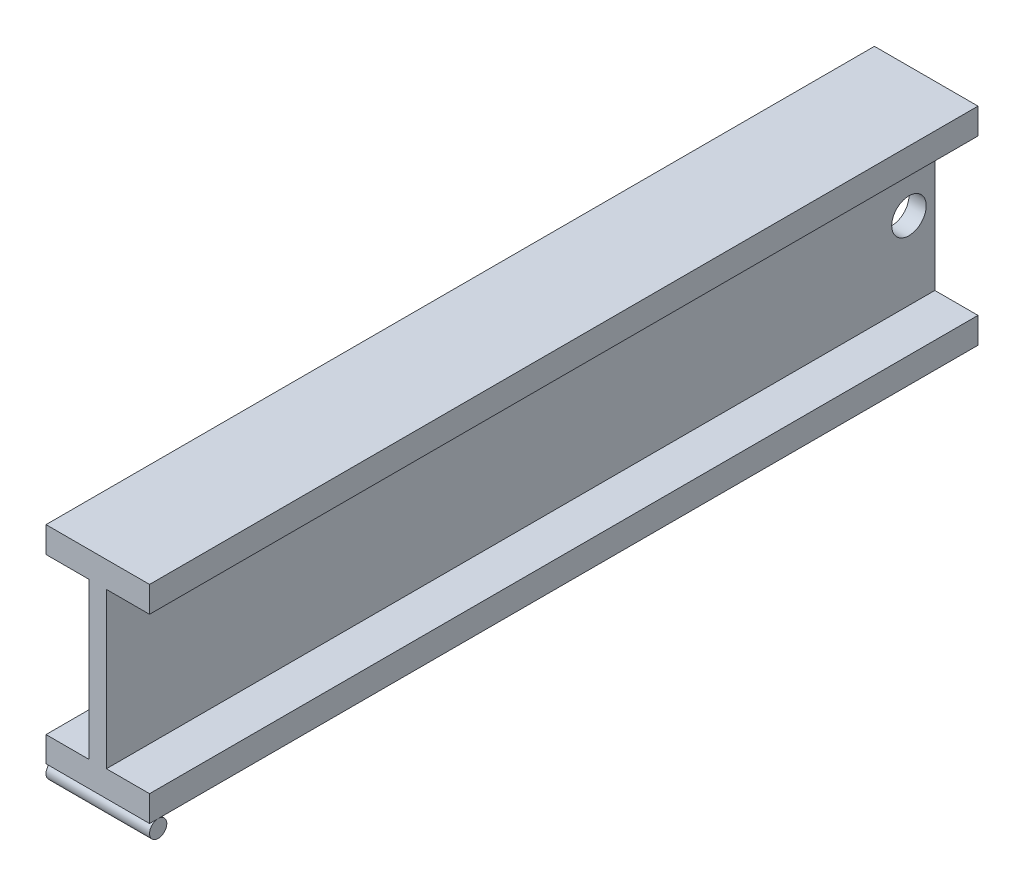
ISO-10303-21;
HEADER;
FILE_DESCRIPTION(('STEP AP214'),'2;1');
FILE_NAME('part.step','',(''),(''),'','','');
FILE_SCHEMA(('AUTOMOTIVE_DESIGN { 1 0 10303 214 1 1 1 1 }'));
ENDSEC;
DATA;
#1=APPLICATION_CONTEXT('core data for automotive mechanical design processes');
#2=APPLICATION_PROTOCOL_DEFINITION('international standard','automotive_design',2000,#1);
#3=PRODUCT_CONTEXT('',#1,'mechanical');
#4=PRODUCT('Part','Part','',(#3));
#5=PRODUCT_RELATED_PRODUCT_CATEGORY('part','',(#4));
#6=PRODUCT_DEFINITION_FORMATION('','',#4);
#7=PRODUCT_DEFINITION_CONTEXT('part definition',#1,'design');
#8=PRODUCT_DEFINITION('design','',#6,#7);
#9=PRODUCT_DEFINITION_SHAPE('','',#8);
#10=(LENGTH_UNIT() NAMED_UNIT(*) SI_UNIT(.MILLI.,.METRE.));
#11=(NAMED_UNIT(*) PLANE_ANGLE_UNIT() SI_UNIT($,.RADIAN.));
#12=(NAMED_UNIT(*) SI_UNIT($,.STERADIAN.) SOLID_ANGLE_UNIT());
#13=UNCERTAINTY_MEASURE_WITH_UNIT(LENGTH_MEASURE(1.E-05),#10,'distance_accuracy_value','');
#14=(GEOMETRIC_REPRESENTATION_CONTEXT(3) GLOBAL_UNCERTAINTY_ASSIGNED_CONTEXT((#13)) GLOBAL_UNIT_ASSIGNED_CONTEXT((#10,
#11,#12)) REPRESENTATION_CONTEXT('',''));
#15=CARTESIAN_POINT('',(0.,0.,0.));
#16=DIRECTION('',(0.,0.,1.));
#17=DIRECTION('',(1.,0.,0.));
#18=AXIS2_PLACEMENT_3D('',#15,#16,#17);
#19=CARTESIAN_POINT('',(76.2,-165.1,1206.5));
#20=DIRECTION('',(-1.,0.,0.));
#21=DIRECTION('',(0.,0.,1.));
#22=AXIS2_PLACEMENT_3D('',#19,#20,#21);
#23=CYLINDRICAL_SURFACE('',#22,12.6999999999999);
#24=CARTESIAN_POINT('',(76.2,-165.1,1206.5));
#25=DIRECTION('',(-1.,0.,0.));
#26=DIRECTION('',(0.,0.,1.));
#27=AXIS2_PLACEMENT_3D('',#24,#25,#26);
#28=CIRCLE('',#27,12.6999999999999);
#29=CARTESIAN_POINT('',(76.2,-165.1,1219.2));
#30=VERTEX_POINT('',#29);
#31=EDGE_CURVE('E11',#30,#30,#28,.T.);
#32=CARTESIAN_POINT('',(-76.2,-165.1,1206.5));
#33=DIRECTION('',(-1.,0.,0.));
#34=DIRECTION('',(0.,0.,1.));
#35=AXIS2_PLACEMENT_3D('',#32,#33,#34);
#36=CIRCLE('',#35,12.6999999999999);
#37=CARTESIAN_POINT('',(-76.2,-165.1,1219.2));
#38=VERTEX_POINT('',#37);
#39=EDGE_CURVE('E57',#38,#38,#36,.T.);
#40=CARTESIAN_POINT('',(76.2,-165.1,1219.2));
#41=CARTESIAN_POINT('',(74.6125,-165.1,1219.2));
#42=CARTESIAN_POINT('',(73.025,-165.1,1219.2));
#43=CARTESIAN_POINT('',(69.85,-165.1,1219.2));
#44=CARTESIAN_POINT('',(68.2625,-165.1,1219.2));
#45=CARTESIAN_POINT('',(65.0875,-165.1,1219.2));
#46=CARTESIAN_POINT('',(63.5,-165.1,1219.2));
#47=CARTESIAN_POINT('',(60.325,-165.1,1219.2));
#48=CARTESIAN_POINT('',(58.7375,-165.1,1219.2));
#49=CARTESIAN_POINT('',(55.5625,-165.1,1219.2));
#50=CARTESIAN_POINT('',(53.975,-165.1,1219.2));
#51=CARTESIAN_POINT('',(50.8,-165.1,1219.2));
#52=CARTESIAN_POINT('',(49.2125,-165.1,1219.2));
#53=CARTESIAN_POINT('',(46.0375,-165.1,1219.2));
#54=CARTESIAN_POINT('',(44.45,-165.1,1219.2));
#55=CARTESIAN_POINT('',(41.275,-165.1,1219.2));
#56=CARTESIAN_POINT('',(39.6875,-165.1,1219.2));
#57=CARTESIAN_POINT('',(36.5125,-165.1,1219.2));
#58=CARTESIAN_POINT('',(34.925,-165.1,1219.2));
#59=CARTESIAN_POINT('',(31.75,-165.1,1219.2));
#60=CARTESIAN_POINT('',(30.1625,-165.1,1219.2));
#61=CARTESIAN_POINT('',(26.9875,-165.1,1219.2));
#62=CARTESIAN_POINT('',(25.4,-165.1,1219.2));
#63=CARTESIAN_POINT('',(22.225,-165.1,1219.2));
#64=CARTESIAN_POINT('',(20.6375,-165.1,1219.2));
#65=CARTESIAN_POINT('',(17.4625,-165.1,1219.2));
#66=CARTESIAN_POINT('',(15.875,-165.1,1219.2));
#67=CARTESIAN_POINT('',(12.7,-165.1,1219.2));
#68=CARTESIAN_POINT('',(11.1125,-165.1,1219.2));
#69=CARTESIAN_POINT('',(7.93750000000002,-165.1,1219.2));
#70=CARTESIAN_POINT('',(6.35000000000002,-165.1,1219.2));
#71=CARTESIAN_POINT('',(3.17500000000002,-165.1,1219.2));
#72=CARTESIAN_POINT('',(1.58750000000001,-165.1,1219.2));
#73=CARTESIAN_POINT('',(-1.58749999999999,-165.1,1219.2));
#74=CARTESIAN_POINT('',(-3.17499999999999,-165.1,1219.2));
#75=CARTESIAN_POINT('',(-6.34999999999999,-165.1,1219.2));
#76=CARTESIAN_POINT('',(-7.93749999999999,-165.1,1219.2));
#77=CARTESIAN_POINT('',(-11.1125,-165.1,1219.2));
#78=CARTESIAN_POINT('',(-12.7,-165.1,1219.2));
#79=CARTESIAN_POINT('',(-15.875,-165.1,1219.2));
#80=CARTESIAN_POINT('',(-17.4625,-165.1,1219.2));
#81=CARTESIAN_POINT('',(-20.6375,-165.1,1219.2));
#82=CARTESIAN_POINT('',(-22.225,-165.1,1219.2));
#83=CARTESIAN_POINT('',(-25.4,-165.1,1219.2));
#84=CARTESIAN_POINT('',(-26.9875,-165.1,1219.2));
#85=CARTESIAN_POINT('',(-30.1625,-165.1,1219.2));
#86=CARTESIAN_POINT('',(-31.75,-165.1,1219.2));
#87=CARTESIAN_POINT('',(-34.925,-165.1,1219.2));
#88=CARTESIAN_POINT('',(-36.5125,-165.1,1219.2));
#89=CARTESIAN_POINT('',(-39.6875,-165.1,1219.2));
#90=CARTESIAN_POINT('',(-41.275,-165.1,1219.2));
#91=CARTESIAN_POINT('',(-44.45,-165.1,1219.2));
#92=CARTESIAN_POINT('',(-46.0375,-165.1,1219.2));
#93=CARTESIAN_POINT('',(-49.2125,-165.1,1219.2));
#94=CARTESIAN_POINT('',(-50.8,-165.1,1219.2));
#95=CARTESIAN_POINT('',(-53.975,-165.1,1219.2));
#96=CARTESIAN_POINT('',(-55.5625,-165.1,1219.2));
#97=CARTESIAN_POINT('',(-58.7375,-165.1,1219.2));
#98=CARTESIAN_POINT('',(-60.325,-165.1,1219.2));
#99=CARTESIAN_POINT('',(-63.5,-165.1,1219.2));
#100=CARTESIAN_POINT('',(-65.0875,-165.1,1219.2));
#101=CARTESIAN_POINT('',(-68.2625,-165.1,1219.2));
#102=CARTESIAN_POINT('',(-69.85,-165.1,1219.2));
#103=CARTESIAN_POINT('',(-73.025,-165.1,1219.2));
#104=CARTESIAN_POINT('',(-74.6125,-165.1,1219.2));
#105=CARTESIAN_POINT('',(-76.2,-165.1,1219.2));
#106=B_SPLINE_CURVE_WITH_KNOTS('',3,(#40,#41,#42,#43,#44,#45,#46,#47,#48,#49,#50,#51,#52,#53,
#54,#55,#56,#57,#58,#59,#60,#61,#62,#63,#64,#65,#66,#67,#68,#69,#70,#71,#72,#73,#74,#75,#76,#77,
#78,#79,#80,#81,#82,#83,#84,#85,#86,#87,#88,#89,#90,#91,#92,#93,#94,#95,#96,#97,#98,#99,#100,
#101,#102,#103,#104,#105),.UNSPECIFIED.,.F.,.F.,(4,2,2,2,2,2,2,2,2,2,2,2,2,2,2,2,2,2,2,2,2,2,2,
2,2,2,2,2,2,2,2,2,4),(0.,4.7625,9.52500000000001,14.2875,19.05,23.8125,28.575,33.3375,38.1,
42.8625,47.625,52.3875,57.15,61.9125,66.675,71.4375,76.2,80.9625,85.725,90.4875,95.25,100.0125,
104.775,109.5375,114.3,119.0625,123.825,128.5875,133.35,138.1125,142.875,147.6375,152.4),.UNSPECIFIED.);
#107=EDGE_CURVE('BSEAM54',#30,#38,#106,.T.);
#108=ORIENTED_EDGE('',*,*,#31,.T.);
#109=ORIENTED_EDGE('',*,*,#39,.F.);
#110=ORIENTED_EDGE('',*,*,#107,.T.);
#111=ORIENTED_EDGE('',*,*,#107,.F.);
#112=EDGE_LOOP('',(#108,#110,#109,#111));
#113=FACE_BOUND('',#112,.T.);
#114=ADVANCED_FACE('F54',(#113),#23,.T.);
#115=CARTESIAN_POINT('',(76.2,0.,0.));
#116=DIRECTION('',(-1.,0.,0.));
#117=DIRECTION('',(0.,0.,1.));
#118=AXIS2_PLACEMENT_3D('',#115,#116,#117);
#119=PLANE('',#118);
#120=ORIENTED_EDGE('',*,*,#31,.F.);
#121=EDGE_LOOP('',(#120));
#122=FACE_BOUND('',#121,.T.);
#123=ADVANCED_FACE('F69',(#122),#119,.F.);
#124=CARTESIAN_POINT('',(-76.2,0.,0.));
#125=DIRECTION('',(-1.,0.,0.));
#126=DIRECTION('',(0.,0.,1.));
#127=AXIS2_PLACEMENT_3D('',#124,#125,#126);
#128=PLANE('',#127);
#129=ORIENTED_EDGE('',*,*,#39,.T.);
#130=EDGE_LOOP('',(#129));
#131=FACE_BOUND('',#130,.T.);
#132=ADVANCED_FACE('F66',(#131),#128,.T.);
#133=CLOSED_SHELL('',(#114,#123,#132));
#134=MANIFOLD_SOLID_BREP('B2',#133);
#135=CARTESIAN_POINT('',(0.,-114.3,1219.2));
#136=DIRECTION('',(0.,-1.,0.));
#137=DIRECTION('',(0.,0.,-1.));
#138=AXIS2_PLACEMENT_3D('',#135,#136,#137);
#139=PLANE('',#138);
#140=DIRECTION('',(-1.,0.,0.));
#141=VECTOR('',#140,1.);
#142=CARTESIAN_POINT('',(0.,-114.3,0.));
#143=LINE('',#142,#141);
#144=CARTESIAN_POINT('',(76.2,-114.3,0.));
#145=VERTEX_POINT('',#144);
#146=CARTESIAN_POINT('',(12.7,-114.3,0.));
#147=VERTEX_POINT('',#146);
#148=EDGE_CURVE('E237',#145,#147,#143,.T.);
#149=ORIENTED_EDGE('',*,*,#148,.T.);
#150=DIRECTION('',(0.,0.,-1.));
#151=VECTOR('',#150,1.);
#152=CARTESIAN_POINT('',(12.7,-114.3,1219.2));
#153=LINE('',#152,#151);
#154=CARTESIAN_POINT('',(12.7,-114.3,1219.2));
#155=VERTEX_POINT('',#154);
#156=EDGE_CURVE('E52',#155,#147,#153,.T.);
#157=ORIENTED_EDGE('',*,*,#156,.F.);
#158=DIRECTION('',(-1.,0.,0.));
#159=VECTOR('',#158,1.);
#160=CARTESIAN_POINT('',(0.,-114.3,1219.2));
#161=LINE('',#160,#159);
#162=CARTESIAN_POINT('',(76.2,-114.3,1219.2));
#163=VERTEX_POINT('',#162);
#164=EDGE_CURVE('E233',#163,#155,#161,.T.);
#165=ORIENTED_EDGE('',*,*,#164,.F.);
#166=DIRECTION('',(0.,0.,-1.));
#167=VECTOR('',#166,1.);
#168=CARTESIAN_POINT('',(76.2,-114.3,1219.2));
#169=LINE('',#168,#167);
#170=EDGE_CURVE('E273',#163,#145,#169,.T.);
#171=ORIENTED_EDGE('',*,*,#170,.T.);
#172=EDGE_LOOP('',(#149,#157,#165,#171));
#173=FACE_BOUND('',#172,.T.);
#174=ADVANCED_FACE('F97',(#173),#139,.F.);
#175=CARTESIAN_POINT('',(12.7,0.,1219.2));
#176=DIRECTION('',(-1.,0.,0.));
#177=DIRECTION('',(0.,-1.,0.));
#178=AXIS2_PLACEMENT_3D('',#175,#176,#177);
#179=PLANE('',#178);
#180=CARTESIAN_POINT('',(12.7,0.,38.1));
#181=DIRECTION('',(-1.,0.,0.));
#182=DIRECTION('',(0.,-1.,0.));
#183=AXIS2_PLACEMENT_3D('',#180,#181,#182);
#184=CIRCLE('',#183,25.4);
#185=CARTESIAN_POINT('',(12.7,-25.4,38.1));
#186=VERTEX_POINT('',#185);
#187=EDGE_CURVE('E235',#186,#186,#184,.T.);
#188=ORIENTED_EDGE('',*,*,#187,.T.);
#189=EDGE_LOOP('',(#188));
#190=FACE_BOUND('',#189,.T.);
#191=DIRECTION('',(0.,1.,0.));
#192=VECTOR('',#191,1.);
#193=CARTESIAN_POINT('',(12.7,0.,0.));
#194=LINE('',#193,#192);
#195=CARTESIAN_POINT('',(12.7,114.3,0.));
#196=VERTEX_POINT('',#195);
#197=EDGE_CURVE('E241',#147,#196,#194,.T.);
#198=ORIENTED_EDGE('',*,*,#197,.T.);
#199=DIRECTION('',(0.,0.,-1.));
#200=VECTOR('',#199,1.);
#201=CARTESIAN_POINT('',(12.7,114.3,1219.2));
#202=LINE('',#201,#200);
#203=CARTESIAN_POINT('',(12.7,114.3,1219.2));
#204=VERTEX_POINT('',#203);
#205=EDGE_CURVE('E107',#204,#196,#202,.T.);
#206=ORIENTED_EDGE('',*,*,#205,.F.);
#207=DIRECTION('',(0.,1.,0.));
#208=VECTOR('',#207,1.);
#209=CARTESIAN_POINT('',(12.7,0.,1219.2));
#210=LINE('',#209,#208);
#211=EDGE_CURVE('E167',#155,#204,#210,.T.);
#212=ORIENTED_EDGE('',*,*,#211,.F.);
#213=ORIENTED_EDGE('',*,*,#156,.T.);
#214=EDGE_LOOP('',(#198,#206,#212,#213));
#215=FACE_BOUND('',#214,.T.);
#216=ADVANCED_FACE('F264',(#190,#215),#179,.F.);
#217=CARTESIAN_POINT('',(0.,114.3,1219.2));
#218=DIRECTION('',(0.,-1.,0.));
#219=DIRECTION('',(1.,0.,0.));
#220=AXIS2_PLACEMENT_3D('',#217,#218,#219);
#221=PLANE('',#220);
#222=DIRECTION('',(-1.,0.,0.));
#223=VECTOR('',#222,1.);
#224=CARTESIAN_POINT('',(0.,114.3,0.));
#225=LINE('',#224,#223);
#226=CARTESIAN_POINT('',(76.2,114.3,0.));
#227=VERTEX_POINT('',#226);
#228=EDGE_CURVE('E278',#227,#196,#225,.T.);
#229=ORIENTED_EDGE('',*,*,#228,.F.);
#230=DIRECTION('',(0.,0.,-1.));
#231=VECTOR('',#230,1.);
#232=CARTESIAN_POINT('',(76.2,114.3,1219.2));
#233=LINE('',#232,#231);
#234=CARTESIAN_POINT('',(76.2,114.3,1219.2));
#235=VERTEX_POINT('',#234);
#236=EDGE_CURVE('E315',#235,#227,#233,.T.);
#237=ORIENTED_EDGE('',*,*,#236,.F.);
#238=DIRECTION('',(-1.,0.,0.));
#239=VECTOR('',#238,1.);
#240=CARTESIAN_POINT('',(0.,114.3,1219.2));
#241=LINE('',#240,#239);
#242=EDGE_CURVE('E227',#235,#204,#241,.T.);
#243=ORIENTED_EDGE('',*,*,#242,.T.);
#244=ORIENTED_EDGE('',*,*,#205,.T.);
#245=EDGE_LOOP('',(#229,#237,#243,#244));
#246=FACE_BOUND('',#245,.T.);
#247=ADVANCED_FACE('F269',(#246),#221,.T.);
#248=CARTESIAN_POINT('',(76.2,0.,1219.2));
#249=DIRECTION('',(-1.,0.,0.));
#250=DIRECTION('',(0.,0.,1.));
#251=AXIS2_PLACEMENT_3D('',#248,#249,#250);
#252=PLANE('',#251);
#253=DIRECTION('',(0.,1.,0.));
#254=VECTOR('',#253,1.);
#255=CARTESIAN_POINT('',(76.2,0.,0.));
#256=LINE('',#255,#254);
#257=CARTESIAN_POINT('',(76.2,152.4,0.));
#258=VERTEX_POINT('',#257);
#259=EDGE_CURVE('E281',#227,#258,#256,.T.);
#260=ORIENTED_EDGE('',*,*,#259,.T.);
#261=DIRECTION('',(0.,0.,-1.));
#262=VECTOR('',#261,1.);
#263=CARTESIAN_POINT('',(76.2,152.4,1219.2));
#264=LINE('',#263,#262);
#265=CARTESIAN_POINT('',(76.2,152.4,1219.2));
#266=VERTEX_POINT('',#265);
#267=EDGE_CURVE('E313',#266,#258,#264,.T.);
#268=ORIENTED_EDGE('',*,*,#267,.F.);
#269=DIRECTION('',(0.,1.,0.));
#270=VECTOR('',#269,1.);
#271=CARTESIAN_POINT('',(76.2,0.,1219.2));
#272=LINE('',#271,#270);
#273=EDGE_CURVE('E224',#235,#266,#272,.T.);
#274=ORIENTED_EDGE('',*,*,#273,.F.);
#275=ORIENTED_EDGE('',*,*,#236,.T.);
#276=EDGE_LOOP('',(#260,#268,#274,#275));
#277=FACE_BOUND('',#276,.T.);
#278=ADVANCED_FACE('F323',(#277),#252,.F.);
#279=CARTESIAN_POINT('',(0.,152.4,1219.2));
#280=DIRECTION('',(0.,1.,0.));
#281=DIRECTION('',(0.,0.,1.));
#282=AXIS2_PLACEMENT_3D('',#279,#280,#281);
#283=PLANE('',#282);
#284=DIRECTION('',(1.,0.,0.));
#285=VECTOR('',#284,1.);
#286=CARTESIAN_POINT('',(0.,152.4,0.));
#287=LINE('',#286,#285);
#288=CARTESIAN_POINT('',(-76.2,152.4,0.));
#289=VERTEX_POINT('',#288);
#290=EDGE_CURVE('E327',#289,#258,#287,.T.);
#291=ORIENTED_EDGE('',*,*,#290,.F.);
#292=DIRECTION('',(0.,0.,-1.));
#293=VECTOR('',#292,1.);
#294=CARTESIAN_POINT('',(-76.2,152.4,1219.2));
#295=LINE('',#294,#293);
#296=CARTESIAN_POINT('',(-76.2,152.4,1219.2));
#297=VERTEX_POINT('',#296);
#298=EDGE_CURVE('E311',#297,#289,#295,.T.);
#299=ORIENTED_EDGE('',*,*,#298,.F.);
#300=DIRECTION('',(1.,0.,0.));
#301=VECTOR('',#300,1.);
#302=CARTESIAN_POINT('',(0.,152.4,1219.2));
#303=LINE('',#302,#301);
#304=EDGE_CURVE('E220',#297,#266,#303,.T.);
#305=ORIENTED_EDGE('',*,*,#304,.T.);
#306=ORIENTED_EDGE('',*,*,#267,.T.);
#307=EDGE_LOOP('',(#291,#299,#305,#306));
#308=FACE_BOUND('',#307,.T.);
#309=ADVANCED_FACE('F326',(#308),#283,.T.);
#310=CARTESIAN_POINT('',(-76.2,0.,1219.2));
#311=DIRECTION('',(-1.,0.,0.));
#312=DIRECTION('',(0.,0.,1.));
#313=AXIS2_PLACEMENT_3D('',#310,#311,#312);
#314=PLANE('',#313);
#315=DIRECTION('',(0.,1.,0.));
#316=VECTOR('',#315,1.);
#317=CARTESIAN_POINT('',(-76.2,0.,0.));
#318=LINE('',#317,#316);
#319=CARTESIAN_POINT('',(-76.2,114.3,0.));
#320=VERTEX_POINT('',#319);
#321=EDGE_CURVE('E329',#320,#289,#318,.T.);
#322=ORIENTED_EDGE('',*,*,#321,.F.);
#323=DIRECTION('',(0.,0.,-1.));
#324=VECTOR('',#323,1.);
#325=CARTESIAN_POINT('',(-76.2,114.3,1219.2));
#326=LINE('',#325,#324);
#327=CARTESIAN_POINT('',(-76.2,114.3,1219.2));
#328=VERTEX_POINT('',#327);
#329=EDGE_CURVE('E309',#328,#320,#326,.T.);
#330=ORIENTED_EDGE('',*,*,#329,.F.);
#331=DIRECTION('',(0.,1.,0.));
#332=VECTOR('',#331,1.);
#333=CARTESIAN_POINT('',(-76.2,0.,1219.2));
#334=LINE('',#333,#332);
#335=EDGE_CURVE('E213',#328,#297,#334,.T.);
#336=ORIENTED_EDGE('',*,*,#335,.T.);
#337=ORIENTED_EDGE('',*,*,#298,.T.);
#338=EDGE_LOOP('',(#322,#330,#336,#337));
#339=FACE_BOUND('',#338,.T.);
#340=ADVANCED_FACE('F343',(#339),#314,.T.);
#341=CARTESIAN_POINT('',(0.,114.3,1219.2));
#342=DIRECTION('',(0.,1.,0.));
#343=DIRECTION('',(-1.,0.,0.));
#344=AXIS2_PLACEMENT_3D('',#341,#342,#343);
#345=PLANE('',#344);
#346=DIRECTION('',(1.,0.,0.));
#347=VECTOR('',#346,1.);
#348=CARTESIAN_POINT('',(0.,114.3,0.));
#349=LINE('',#348,#347);
#350=CARTESIAN_POINT('',(-12.7,114.3,0.));
#351=VERTEX_POINT('',#350);
#352=EDGE_CURVE('E294',#320,#351,#349,.T.);
#353=ORIENTED_EDGE('',*,*,#352,.T.);
#354=DIRECTION('',(0.,0.,-1.));
#355=VECTOR('',#354,1.);
#356=CARTESIAN_POINT('',(-12.7,114.3,1219.2));
#357=LINE('',#356,#355);
#358=CARTESIAN_POINT('',(-12.7,114.3,1219.2));
#359=VERTEX_POINT('',#358);
#360=EDGE_CURVE('E306',#359,#351,#357,.T.);
#361=ORIENTED_EDGE('',*,*,#360,.F.);
#362=DIRECTION('',(1.,0.,0.));
#363=VECTOR('',#362,1.);
#364=CARTESIAN_POINT('',(0.,114.3,1219.2));
#365=LINE('',#364,#363);
#366=EDGE_CURVE('E219',#328,#359,#365,.T.);
#367=ORIENTED_EDGE('',*,*,#366,.F.);
#368=ORIENTED_EDGE('',*,*,#329,.T.);
#369=EDGE_LOOP('',(#353,#361,#367,#368));
#370=FACE_BOUND('',#369,.T.);
#371=ADVANCED_FACE('F342',(#370),#345,.F.);
#372=CARTESIAN_POINT('',(-12.6999999999999,0.,1219.2));
#373=DIRECTION('',(1.,0.,0.));
#374=DIRECTION('',(0.,1.,0.));
#375=AXIS2_PLACEMENT_3D('',#372,#373,#374);
#376=PLANE('',#375);
#377=CARTESIAN_POINT('',(-12.6999999999999,0.,38.1));
#378=DIRECTION('',(1.,0.,0.));
#379=DIRECTION('',(0.,1.,0.));
#380=AXIS2_PLACEMENT_3D('',#377,#378,#379);
#381=CIRCLE('',#380,25.4);
#382=CARTESIAN_POINT('',(-12.6999999999999,-25.4,38.1));
#383=VERTEX_POINT('',#382);
#384=EDGE_CURVE('E100',#383,#383,#381,.T.);
#385=ORIENTED_EDGE('',*,*,#384,.T.);
#386=EDGE_LOOP('',(#385));
#387=FACE_BOUND('',#386,.T.);
#388=DIRECTION('',(0.,-1.,0.));
#389=VECTOR('',#388,1.);
#390=CARTESIAN_POINT('',(-12.6999999999999,0.,0.));
#391=LINE('',#390,#389);
#392=CARTESIAN_POINT('',(-12.6999999999998,-115.168197492479,0.));
#393=VERTEX_POINT('',#392);
#394=EDGE_CURVE('E288',#351,#393,#391,.T.);
#395=ORIENTED_EDGE('',*,*,#394,.T.);
#396=DIRECTION('',(0.,0.,-1.));
#397=VECTOR('',#396,1.);
#398=CARTESIAN_POINT('',(-12.6999999999998,-115.168197492479,1219.2));
#399=LINE('',#398,#397);
#400=CARTESIAN_POINT('',(-12.6999999999998,-115.168197492479,1219.2));
#401=VERTEX_POINT('',#400);
#402=EDGE_CURVE('E304',#401,#393,#399,.T.);
#403=ORIENTED_EDGE('',*,*,#402,.F.);
#404=DIRECTION('',(0.,-1.,0.));
#405=VECTOR('',#404,1.);
#406=CARTESIAN_POINT('',(-12.6999999999999,0.,1219.2));
#407=LINE('',#406,#405);
#408=EDGE_CURVE('E214',#359,#401,#407,.T.);
#409=ORIENTED_EDGE('',*,*,#408,.F.);
#410=ORIENTED_EDGE('',*,*,#360,.T.);
#411=EDGE_LOOP('',(#395,#403,#409,#410));
#412=FACE_BOUND('',#411,.T.);
#413=ADVANCED_FACE('F249',(#387,#412),#376,.F.);
#414=CARTESIAN_POINT('',(1.00679042961203E-13,-115.168197492479,1219.2));
#415=DIRECTION('',(0.,1.,0.));
#416=DIRECTION('',(-1.,0.,0.));
#417=AXIS2_PLACEMENT_3D('',#414,#415,#416);
#418=PLANE('',#417);
#419=DIRECTION('',(1.,0.,0.));
#420=VECTOR('',#419,1.);
#421=CARTESIAN_POINT('',(1.00679042961203E-13,-115.168197492479,0.));
#422=LINE('',#421,#420);
#423=CARTESIAN_POINT('',(-76.2,-115.168197492479,0.));
#424=VERTEX_POINT('',#423);
#425=EDGE_CURVE('E293',#424,#393,#422,.T.);
#426=ORIENTED_EDGE('',*,*,#425,.F.);
#427=DIRECTION('',(0.,0.,-1.));
#428=VECTOR('',#427,1.);
#429=CARTESIAN_POINT('',(-76.2,-115.168197492479,1219.2));
#430=LINE('',#429,#428);
#431=CARTESIAN_POINT('',(-76.2,-115.168197492479,1219.2));
#432=VERTEX_POINT('',#431);
#433=EDGE_CURVE('E203',#432,#424,#430,.T.);
#434=ORIENTED_EDGE('',*,*,#433,.F.);
#435=DIRECTION('',(1.,0.,0.));
#436=VECTOR('',#435,1.);
#437=CARTESIAN_POINT('',(1.00679042961203E-13,-115.168197492479,1219.2));
#438=LINE('',#437,#436);
#439=EDGE_CURVE('E211',#432,#401,#438,.T.);
#440=ORIENTED_EDGE('',*,*,#439,.T.);
#441=ORIENTED_EDGE('',*,*,#402,.T.);
#442=EDGE_LOOP('',(#426,#434,#440,#441));
#443=FACE_BOUND('',#442,.T.);
#444=ADVANCED_FACE('F336',(#443),#418,.T.);
#445=CARTESIAN_POINT('',(-76.2,-152.4,0.));
#446=VERTEX_POINT('',#445);
#447=EDGE_CURVE('E200',#446,#424,#318,.T.);
#448=ORIENTED_EDGE('',*,*,#447,.F.);
#449=DIRECTION('',(0.,0.,-1.));
#450=VECTOR('',#449,1.);
#451=CARTESIAN_POINT('',(-76.2,-152.4,1219.2));
#452=LINE('',#451,#450);
#453=CARTESIAN_POINT('',(-76.2,-152.4,1219.2));
#454=VERTEX_POINT('',#453);
#455=EDGE_CURVE('E194',#454,#446,#452,.T.);
#456=ORIENTED_EDGE('',*,*,#455,.F.);
#457=EDGE_CURVE('E198',#454,#432,#334,.T.);
#458=ORIENTED_EDGE('',*,*,#457,.T.);
#459=ORIENTED_EDGE('',*,*,#433,.T.);
#460=EDGE_LOOP('',(#448,#456,#458,#459));
#461=FACE_BOUND('',#460,.T.);
#462=ADVANCED_FACE('F196',(#461),#314,.T.);
#463=CARTESIAN_POINT('',(0.,-152.4,1219.2));
#464=DIRECTION('',(0.,1.,0.));
#465=DIRECTION('',(0.,0.,1.));
#466=AXIS2_PLACEMENT_3D('',#463,#464,#465);
#467=PLANE('',#466);
#468=DIRECTION('',(1.,0.,0.));
#469=VECTOR('',#468,1.);
#470=CARTESIAN_POINT('',(0.,-152.4,0.));
#471=LINE('',#470,#469);
#472=CARTESIAN_POINT('',(76.2,-152.4,0.));
#473=VERTEX_POINT('',#472);
#474=EDGE_CURVE('E298',#446,#473,#471,.T.);
#475=ORIENTED_EDGE('',*,*,#474,.T.);
#476=DIRECTION('',(0.,0.,-1.));
#477=VECTOR('',#476,1.);
#478=CARTESIAN_POINT('',(76.2,-152.4,1219.2));
#479=LINE('',#478,#477);
#480=CARTESIAN_POINT('',(76.2,-152.4,1219.2));
#481=VERTEX_POINT('',#480);
#482=EDGE_CURVE('E155',#481,#473,#479,.T.);
#483=ORIENTED_EDGE('',*,*,#482,.F.);
#484=DIRECTION('',(1.,0.,0.));
#485=VECTOR('',#484,1.);
#486=CARTESIAN_POINT('',(0.,-152.4,1219.2));
#487=LINE('',#486,#485);
#488=EDGE_CURVE('E205',#454,#481,#487,.T.);
#489=ORIENTED_EDGE('',*,*,#488,.F.);
#490=ORIENTED_EDGE('',*,*,#455,.T.);
#491=EDGE_LOOP('',(#475,#483,#489,#490));
#492=FACE_BOUND('',#491,.T.);
#493=ADVANCED_FACE('F206',(#492),#467,.F.);
#494=CARTESIAN_POINT('',(76.2,0.,1219.2));
#495=DIRECTION('',(-1.,0.,0.));
#496=DIRECTION('',(0.,0.,1.));
#497=AXIS2_PLACEMENT_3D('',#494,#495,#496);
#498=PLANE('',#497);
#499=DIRECTION('',(0.,1.,0.));
#500=VECTOR('',#499,1.);
#501=CARTESIAN_POINT('',(76.2,0.,0.));
#502=LINE('',#501,#500);
#503=EDGE_CURVE('E159',#473,#145,#502,.T.);
#504=ORIENTED_EDGE('',*,*,#503,.T.);
#505=ORIENTED_EDGE('',*,*,#170,.F.);
#506=DIRECTION('',(0.,1.,0.));
#507=VECTOR('',#506,1.);
#508=CARTESIAN_POINT('',(76.2,0.,1219.2));
#509=LINE('',#508,#507);
#510=EDGE_CURVE('E115',#481,#163,#509,.T.);
#511=ORIENTED_EDGE('',*,*,#510,.F.);
#512=ORIENTED_EDGE('',*,*,#482,.T.);
#513=EDGE_LOOP('',(#504,#505,#511,#512));
#514=FACE_BOUND('',#513,.T.);
#515=ADVANCED_FACE('F359',(#514),#498,.F.);
#516=CARTESIAN_POINT('',(0.,0.,1219.2));
#517=DIRECTION('',(0.,0.,1.));
#518=DIRECTION('',(1.,0.,0.));
#519=AXIS2_PLACEMENT_3D('',#516,#517,#518);
#520=PLANE('',#519);
#521=ORIENTED_EDGE('',*,*,#164,.T.);
#522=ORIENTED_EDGE('',*,*,#211,.T.);
#523=ORIENTED_EDGE('',*,*,#242,.F.);
#524=ORIENTED_EDGE('',*,*,#273,.T.);
#525=ORIENTED_EDGE('',*,*,#304,.F.);
#526=ORIENTED_EDGE('',*,*,#335,.F.);
#527=ORIENTED_EDGE('',*,*,#366,.T.);
#528=ORIENTED_EDGE('',*,*,#408,.T.);
#529=ORIENTED_EDGE('',*,*,#439,.F.);
#530=ORIENTED_EDGE('',*,*,#457,.F.);
#531=ORIENTED_EDGE('',*,*,#488,.T.);
#532=ORIENTED_EDGE('',*,*,#510,.T.);
#533=EDGE_LOOP('',(#521,#522,#523,#524,#525,#526,#527,#528,#529,#530,#531,#532));
#534=FACE_BOUND('',#533,.T.);
#535=ADVANCED_FACE('F209',(#534),#520,.T.);
#536=CARTESIAN_POINT('',(0.,0.,0.));
#537=DIRECTION('',(0.,0.,1.));
#538=DIRECTION('',(1.,0.,0.));
#539=AXIS2_PLACEMENT_3D('',#536,#537,#538);
#540=PLANE('',#539);
#541=ORIENTED_EDGE('',*,*,#148,.F.);
#542=ORIENTED_EDGE('',*,*,#503,.F.);
#543=ORIENTED_EDGE('',*,*,#474,.F.);
#544=ORIENTED_EDGE('',*,*,#447,.T.);
#545=ORIENTED_EDGE('',*,*,#425,.T.);
#546=ORIENTED_EDGE('',*,*,#394,.F.);
#547=ORIENTED_EDGE('',*,*,#352,.F.);
#548=ORIENTED_EDGE('',*,*,#321,.T.);
#549=ORIENTED_EDGE('',*,*,#290,.T.);
#550=ORIENTED_EDGE('',*,*,#259,.F.);
#551=ORIENTED_EDGE('',*,*,#228,.T.);
#552=ORIENTED_EDGE('',*,*,#197,.F.);
#553=EDGE_LOOP('',(#541,#542,#543,#544,#545,#546,#547,#548,#549,#550,#551,#552));
#554=FACE_BOUND('',#553,.T.);
#555=ADVANCED_FACE('F255',(#554),#540,.F.);
#556=CARTESIAN_POINT('',(28.4480000000001,0.,38.1));
#557=DIRECTION('',(-1.,0.,0.));
#558=DIRECTION('',(0.,-1.,0.));
#559=AXIS2_PLACEMENT_3D('',#556,#557,#558);
#560=CYLINDRICAL_SURFACE('',#559,25.4);
#561=CARTESIAN_POINT('',(-12.6999999999999,-25.4,38.1));
#562=CARTESIAN_POINT('',(-12.4354166666665,-25.4,38.1));
#563=CARTESIAN_POINT('',(-12.1708333333332,-25.4,38.1));
#564=CARTESIAN_POINT('',(-11.6416666666665,-25.4,38.1));
#565=CARTESIAN_POINT('',(-11.3770833333332,-25.4,38.1));
#566=CARTESIAN_POINT('',(-10.8479166666666,-25.4,38.1));
#567=CARTESIAN_POINT('',(-10.5833333333332,-25.4,38.1));
#568=CARTESIAN_POINT('',(-10.0541666666666,-25.4,38.1));
#569=CARTESIAN_POINT('',(-9.78958333333322,-25.4,38.1));
#570=CARTESIAN_POINT('',(-9.26041666666656,-25.4,38.1));
#571=CARTESIAN_POINT('',(-8.99583333333322,-25.4,38.1));
#572=CARTESIAN_POINT('',(-8.46666666666656,-25.4,38.1));
#573=CARTESIAN_POINT('',(-8.20208333333322,-25.4,38.1));
#574=CARTESIAN_POINT('',(-7.67291666666656,-25.4,38.1));
#575=CARTESIAN_POINT('',(-7.40833333333323,-25.4,38.1));
#576=CARTESIAN_POINT('',(-6.87916666666657,-25.4,38.1));
#577=CARTESIAN_POINT('',(-6.61458333333323,-25.4,38.1));
#578=CARTESIAN_POINT('',(-6.08541666666657,-25.4,38.1));
#579=CARTESIAN_POINT('',(-5.82083333333324,-25.4,38.1));
#580=CARTESIAN_POINT('',(-5.29166666666657,-25.4,38.1));
#581=CARTESIAN_POINT('',(-5.02708333333324,-25.4,38.1));
#582=CARTESIAN_POINT('',(-4.49791666666657,-25.4,38.1));
#583=CARTESIAN_POINT('',(-4.23333333333324,-25.4,38.1));
#584=CARTESIAN_POINT('',(-3.70416666666657,-25.4,38.1));
#585=CARTESIAN_POINT('',(-3.43958333333324,-25.4,38.1));
#586=CARTESIAN_POINT('',(-2.91041666666658,-25.4,38.1));
#587=CARTESIAN_POINT('',(-2.64583333333325,-25.4,38.1));
#588=CARTESIAN_POINT('',(-2.11666666666658,-25.4,38.1));
#589=CARTESIAN_POINT('',(-1.85208333333325,-25.4,38.1));
#590=CARTESIAN_POINT('',(-1.32291666666659,-25.4,38.1));
#591=CARTESIAN_POINT('',(-1.05833333333325,-25.4,38.1));
#592=CARTESIAN_POINT('',(-0.529166666666591,-25.4,38.1));
#593=CARTESIAN_POINT('',(-0.264583333333259,-25.4,38.1));
#594=CARTESIAN_POINT('',(0.264583333333405,-25.4,38.1));
#595=CARTESIAN_POINT('',(0.529166666666737,-25.4,38.1));
#596=CARTESIAN_POINT('',(1.0583333333334,-25.4,38.1));
#597=CARTESIAN_POINT('',(1.32291666666673,-25.4,38.1));
#598=CARTESIAN_POINT('',(1.8520833333334,-25.4,38.1));
#599=CARTESIAN_POINT('',(2.11666666666673,-25.4,38.1));
#600=CARTESIAN_POINT('',(2.6458333333334,-25.4,38.1));
#601=CARTESIAN_POINT('',(2.91041666666673,-25.4,38.1));
#602=CARTESIAN_POINT('',(3.43958333333339,-25.4,38.1));
#603=CARTESIAN_POINT('',(3.70416666666672,-25.4,38.1));
#604=CARTESIAN_POINT('',(4.23333333333339,-25.4,38.1));
#605=CARTESIAN_POINT('',(4.49791666666672,-25.4,38.1));
#606=CARTESIAN_POINT('',(5.02708333333339,-25.4,38.1));
#607=CARTESIAN_POINT('',(5.29166666666672,-25.4,38.1));
#608=CARTESIAN_POINT('',(5.82083333333338,-25.4,38.1));
#609=CARTESIAN_POINT('',(6.08541666666671,-25.4,38.1));
#610=CARTESIAN_POINT('',(6.61458333333338,-25.4,38.1));
#611=CARTESIAN_POINT('',(6.87916666666671,-25.4,38.1));
#612=CARTESIAN_POINT('',(7.40833333333337,-25.4,38.1));
#613=CARTESIAN_POINT('',(7.67291666666671,-25.4,38.1));
#614=CARTESIAN_POINT('',(8.20208333333337,-25.4,38.1));
#615=CARTESIAN_POINT('',(8.4666666666667,-25.4,38.1));
#616=CARTESIAN_POINT('',(8.99583333333337,-25.4,38.1));
#617=CARTESIAN_POINT('',(9.2604166666667,-25.4,38.1));
#618=CARTESIAN_POINT('',(9.78958333333336,-25.4,38.1));
#619=CARTESIAN_POINT('',(10.0541666666667,-25.4,38.1));
#620=CARTESIAN_POINT('',(10.5833333333334,-25.4,38.1));
#621=CARTESIAN_POINT('',(10.8479166666667,-25.4,38.1));
#622=CARTESIAN_POINT('',(11.3770833333334,-25.4,38.1));
#623=CARTESIAN_POINT('',(11.6416666666667,-25.4,38.1));
#624=CARTESIAN_POINT('',(12.1708333333334,-25.4,38.1));
#625=CARTESIAN_POINT('',(12.4354166666667,-25.4,38.1));
#626=CARTESIAN_POINT('',(12.7,-25.4,38.1));
#627=B_SPLINE_CURVE_WITH_KNOTS('',3,(#561,#562,#563,#564,#565,#566,#567,#568,#569,#570,#571,
#572,#573,#574,#575,#576,#577,#578,#579,#580,#581,#582,#583,#584,#585,#586,#587,#588,#589,#590,
#591,#592,#593,#594,#595,#596,#597,#598,#599,#600,#601,#602,#603,#604,#605,#606,#607,#608,#609,
#610,#611,#612,#613,#614,#615,#616,#617,#618,#619,#620,#621,#622,#623,#624,#625,#626),
.UNSPECIFIED.,.F.,.F.,(4,2,2,2,2,2,2,2,2,2,2,2,2,2,2,2,2,2,2,2,2,2,2,2,2,2,2,2,2,2,2,2,4),(0.,
0.793749999999996,1.58749999999999,2.38124999999999,3.17499999999998,3.96874999999999,
4.76249999999998,5.55624999999998,6.34999999999997,7.14374999999997,7.93749999999997,
8.73124999999997,9.52499999999996,10.31875,11.1125,11.90625,12.6999999999999,13.4937499999999,
14.2874999999999,15.0812499999999,15.8749999999999,16.6687499999999,17.4624999999999,
18.2562499999999,19.0499999999999,19.8437499999999,20.6374999999999,21.4312499999999,
22.2249999999999,23.0187499999999,23.8124999999999,24.6062499999999,25.3999999999999),.UNSPECIFIED.);
#628=EDGE_CURVE('BSEAM252',#383,#186,#627,.T.);
#629=ORIENTED_EDGE('',*,*,#384,.F.);
#630=ORIENTED_EDGE('',*,*,#187,.F.);
#631=ORIENTED_EDGE('',*,*,#628,.T.);
#632=ORIENTED_EDGE('',*,*,#628,.F.);
#633=EDGE_LOOP('',(#629,#631,#630,#632));
#634=FACE_BOUND('',#633,.T.);
#635=ADVANCED_FACE('F252',(#634),#560,.F.);
#636=CLOSED_SHELL('',(#174,#216,#247,#278,#309,#340,#371,#413,#444,#462,#493,#515,#535,#555,#635));
#637=MANIFOLD_SOLID_BREP('B6',#636);
#638=ADVANCED_BREP_SHAPE_REPRESENTATION('',(#18,#134,#637),#14);
#639=SHAPE_DEFINITION_REPRESENTATION(#9,#638);
ENDSEC;
END-ISO-10303-21;
